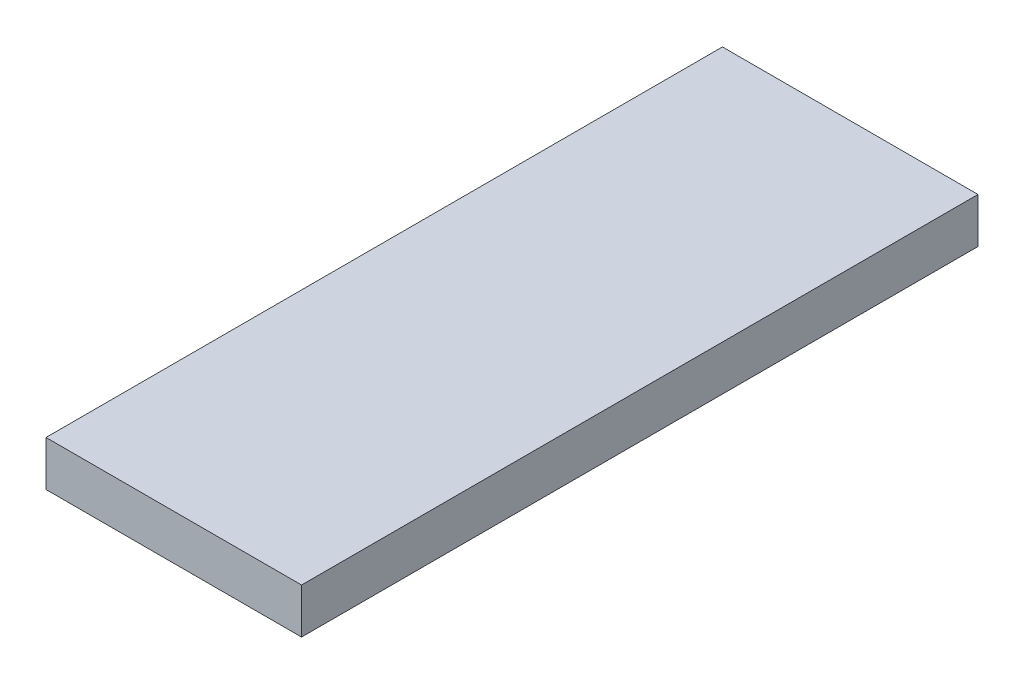
ISO-10303-21;
HEADER;
FILE_DESCRIPTION(('STEP AP214'),'2;1');
FILE_NAME('part.step','',(''),(''),'','','');
FILE_SCHEMA(('AUTOMOTIVE_DESIGN { 1 0 10303 214 1 1 1 1 }'));
ENDSEC;
DATA;
#1=APPLICATION_CONTEXT('core data for automotive mechanical design processes');
#2=APPLICATION_PROTOCOL_DEFINITION('international standard','automotive_design',2000,#1);
#3=PRODUCT_CONTEXT('',#1,'mechanical');
#4=PRODUCT('Part','Part','',(#3));
#5=PRODUCT_RELATED_PRODUCT_CATEGORY('part','',(#4));
#6=PRODUCT_DEFINITION_FORMATION('','',#4);
#7=PRODUCT_DEFINITION_CONTEXT('part definition',#1,'design');
#8=PRODUCT_DEFINITION('design','',#6,#7);
#9=PRODUCT_DEFINITION_SHAPE('','',#8);
#10=(LENGTH_UNIT() NAMED_UNIT(*) SI_UNIT(.MILLI.,.METRE.));
#11=(NAMED_UNIT(*) PLANE_ANGLE_UNIT() SI_UNIT($,.RADIAN.));
#12=(NAMED_UNIT(*) SI_UNIT($,.STERADIAN.) SOLID_ANGLE_UNIT());
#13=UNCERTAINTY_MEASURE_WITH_UNIT(LENGTH_MEASURE(1.E-05),#10,'distance_accuracy_value','');
#14=(GEOMETRIC_REPRESENTATION_CONTEXT(3) GLOBAL_UNCERTAINTY_ASSIGNED_CONTEXT((#13)) GLOBAL_UNIT_ASSIGNED_CONTEXT((#10,
#11,#12)) REPRESENTATION_CONTEXT('',''));
#15=CARTESIAN_POINT('',(0.,0.,0.));
#16=DIRECTION('',(0.,0.,1.));
#17=DIRECTION('',(1.,0.,0.));
#18=AXIS2_PLACEMENT_3D('',#15,#16,#17);
#19=CARTESIAN_POINT('',(-8.5,3.,-22.5));
#20=DIRECTION('',(1.,0.,0.));
#21=DIRECTION('',(0.,0.,-1.));
#22=AXIS2_PLACEMENT_3D('',#19,#20,#21);
#23=PLANE('',#22);
#24=DIRECTION('',(0.,0.,1.));
#25=VECTOR('',#24,1.);
#26=CARTESIAN_POINT('',(-8.5,0.,-22.5));
#27=LINE('',#26,#25);
#28=CARTESIAN_POINT('',(-8.5,0.,-22.5));
#29=VERTEX_POINT('',#28);
#30=CARTESIAN_POINT('',(-8.49999999999999,0.,22.5));
#31=VERTEX_POINT('',#30);
#32=EDGE_CURVE('E102',#29,#31,#27,.T.);
#33=ORIENTED_EDGE('',*,*,#32,.T.);
#34=DIRECTION('',(0.,-1.,0.));
#35=VECTOR('',#34,1.);
#36=CARTESIAN_POINT('',(-8.49999999999999,3.,22.5));
#37=LINE('',#36,#35);
#38=CARTESIAN_POINT('',(-8.49999999999999,3.,22.5));
#39=VERTEX_POINT('',#38);
#40=EDGE_CURVE('E11',#39,#31,#37,.T.);
#41=ORIENTED_EDGE('',*,*,#40,.F.);
#42=DIRECTION('',(0.,0.,1.));
#43=VECTOR('',#42,1.);
#44=CARTESIAN_POINT('',(-8.5,3.,-22.5));
#45=LINE('',#44,#43);
#46=CARTESIAN_POINT('',(-8.5,3.,-22.5));
#47=VERTEX_POINT('',#46);
#48=EDGE_CURVE('E90',#47,#39,#45,.T.);
#49=ORIENTED_EDGE('',*,*,#48,.F.);
#50=DIRECTION('',(0.,-1.,0.));
#51=VECTOR('',#50,1.);
#52=CARTESIAN_POINT('',(-8.5,3.,-22.5));
#53=LINE('',#52,#51);
#54=EDGE_CURVE('E98',#47,#29,#53,.T.);
#55=ORIENTED_EDGE('',*,*,#54,.T.);
#56=EDGE_LOOP('',(#33,#41,#49,#55));
#57=FACE_BOUND('',#56,.T.);
#58=ADVANCED_FACE('F39',(#57),#23,.F.);
#59=CARTESIAN_POINT('',(8.50000000000001,3.,22.5));
#60=DIRECTION('',(0.,0.,-1.));
#61=DIRECTION('',(-1.,0.,0.));
#62=AXIS2_PLACEMENT_3D('',#59,#60,#61);
#63=PLANE('',#62);
#64=DIRECTION('',(1.,0.,0.));
#65=VECTOR('',#64,1.);
#66=CARTESIAN_POINT('',(8.50000000000001,0.,22.5));
#67=LINE('',#66,#65);
#68=CARTESIAN_POINT('',(8.50000000000001,0.,22.5));
#69=VERTEX_POINT('',#68);
#70=EDGE_CURVE('E94',#31,#69,#67,.T.);
#71=ORIENTED_EDGE('',*,*,#70,.T.);
#72=DIRECTION('',(0.,-1.,0.));
#73=VECTOR('',#72,1.);
#74=CARTESIAN_POINT('',(8.50000000000001,3.,22.5));
#75=LINE('',#74,#73);
#76=CARTESIAN_POINT('',(8.50000000000001,3.,22.5));
#77=VERTEX_POINT('',#76);
#78=EDGE_CURVE('E47',#77,#69,#75,.T.);
#79=ORIENTED_EDGE('',*,*,#78,.F.);
#80=DIRECTION('',(1.,0.,0.));
#81=VECTOR('',#80,1.);
#82=CARTESIAN_POINT('',(8.50000000000001,3.,22.5));
#83=LINE('',#82,#81);
#84=EDGE_CURVE('E85',#39,#77,#83,.T.);
#85=ORIENTED_EDGE('',*,*,#84,.F.);
#86=ORIENTED_EDGE('',*,*,#40,.T.);
#87=EDGE_LOOP('',(#71,#79,#85,#86));
#88=FACE_BOUND('',#87,.T.);
#89=ADVANCED_FACE('F93',(#88),#63,.F.);
#90=CARTESIAN_POINT('',(8.5,3.,-22.5));
#91=DIRECTION('',(-1.,0.,0.));
#92=DIRECTION('',(0.,0.,1.));
#93=AXIS2_PLACEMENT_3D('',#90,#91,#92);
#94=PLANE('',#93);
#95=DIRECTION('',(0.,0.,-1.));
#96=VECTOR('',#95,1.);
#97=CARTESIAN_POINT('',(8.5,0.,-22.5));
#98=LINE('',#97,#96);
#99=CARTESIAN_POINT('',(8.5,0.,-22.5));
#100=VERTEX_POINT('',#99);
#101=EDGE_CURVE('E72',#69,#100,#98,.T.);
#102=ORIENTED_EDGE('',*,*,#101,.T.);
#103=DIRECTION('',(0.,-1.,0.));
#104=VECTOR('',#103,1.);
#105=CARTESIAN_POINT('',(8.5,3.,-22.5));
#106=LINE('',#105,#104);
#107=CARTESIAN_POINT('',(8.5,3.,-22.5));
#108=VERTEX_POINT('',#107);
#109=EDGE_CURVE('E95',#108,#100,#106,.T.);
#110=ORIENTED_EDGE('',*,*,#109,.F.);
#111=DIRECTION('',(0.,0.,-1.));
#112=VECTOR('',#111,1.);
#113=CARTESIAN_POINT('',(8.5,3.,-22.5));
#114=LINE('',#113,#112);
#115=EDGE_CURVE('E88',#77,#108,#114,.T.);
#116=ORIENTED_EDGE('',*,*,#115,.F.);
#117=ORIENTED_EDGE('',*,*,#78,.T.);
#118=EDGE_LOOP('',(#102,#110,#116,#117));
#119=FACE_BOUND('',#118,.T.);
#120=ADVANCED_FACE('F96',(#119),#94,.F.);
#121=CARTESIAN_POINT('',(8.5,3.,-22.5));
#122=DIRECTION('',(0.,0.,1.));
#123=DIRECTION('',(1.,0.,0.));
#124=AXIS2_PLACEMENT_3D('',#121,#122,#123);
#125=PLANE('',#124);
#126=DIRECTION('',(-1.,0.,0.));
#127=VECTOR('',#126,1.);
#128=CARTESIAN_POINT('',(8.5,0.,-22.5));
#129=LINE('',#128,#127);
#130=EDGE_CURVE('E78',#100,#29,#129,.T.);
#131=ORIENTED_EDGE('',*,*,#130,.T.);
#132=ORIENTED_EDGE('',*,*,#54,.F.);
#133=DIRECTION('',(-1.,0.,0.));
#134=VECTOR('',#133,1.);
#135=CARTESIAN_POINT('',(8.5,3.,-22.5));
#136=LINE('',#135,#134);
#137=EDGE_CURVE('E55',#108,#47,#136,.T.);
#138=ORIENTED_EDGE('',*,*,#137,.F.);
#139=ORIENTED_EDGE('',*,*,#109,.T.);
#140=EDGE_LOOP('',(#131,#132,#138,#139));
#141=FACE_BOUND('',#140,.T.);
#142=ADVANCED_FACE('F109',(#141),#125,.F.);
#143=CARTESIAN_POINT('',(0.,3.,0.));
#144=DIRECTION('',(0.,-1.,0.));
#145=DIRECTION('',(0.,0.,-1.));
#146=AXIS2_PLACEMENT_3D('',#143,#144,#145);
#147=PLANE('',#146);
#148=ORIENTED_EDGE('',*,*,#48,.T.);
#149=ORIENTED_EDGE('',*,*,#84,.T.);
#150=ORIENTED_EDGE('',*,*,#115,.T.);
#151=ORIENTED_EDGE('',*,*,#137,.T.);
#152=EDGE_LOOP('',(#148,#149,#150,#151));
#153=FACE_BOUND('',#152,.T.);
#154=ADVANCED_FACE('F86',(#153),#147,.F.);
#155=CARTESIAN_POINT('',(0.,0.,0.));
#156=DIRECTION('',(0.,-1.,0.));
#157=DIRECTION('',(0.,0.,-1.));
#158=AXIS2_PLACEMENT_3D('',#155,#156,#157);
#159=PLANE('',#158);
#160=ORIENTED_EDGE('',*,*,#32,.F.);
#161=ORIENTED_EDGE('',*,*,#130,.F.);
#162=ORIENTED_EDGE('',*,*,#101,.F.);
#163=ORIENTED_EDGE('',*,*,#70,.F.);
#164=EDGE_LOOP('',(#160,#161,#162,#163));
#165=FACE_BOUND('',#164,.T.);
#166=ADVANCED_FACE('F112',(#165),#159,.T.);
#167=CLOSED_SHELL('',(#58,#89,#120,#142,#154,#166));
#168=MANIFOLD_SOLID_BREP('B2',#167);
#169=ADVANCED_BREP_SHAPE_REPRESENTATION('',(#18,#168),#14);
#170=SHAPE_DEFINITION_REPRESENTATION(#9,#169);
ENDSEC;
END-ISO-10303-21;
